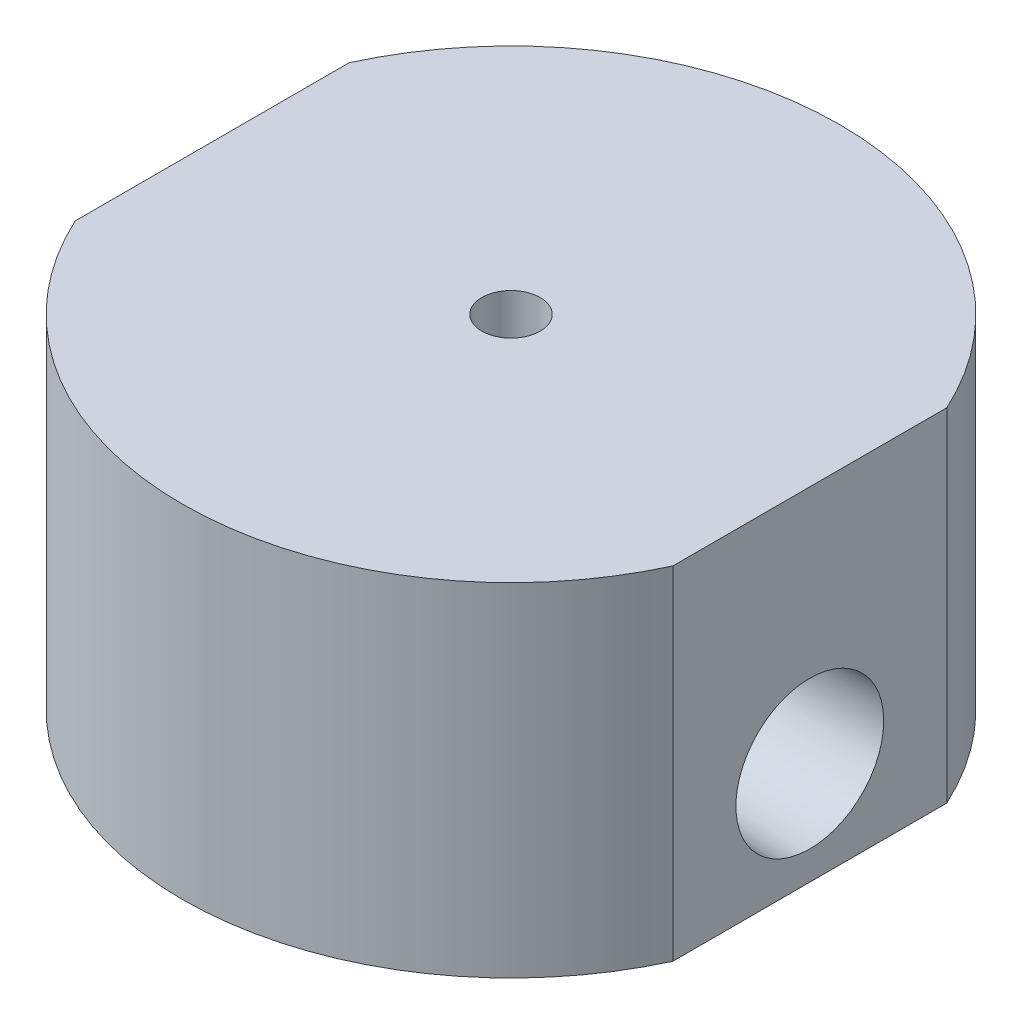
ISO-10303-21;
HEADER;
FILE_DESCRIPTION(('STEP AP214'),'2;1');
FILE_NAME('part.step','',(''),(''),'','','');
FILE_SCHEMA(('AUTOMOTIVE_DESIGN { 1 0 10303 214 1 1 1 1 }'));
ENDSEC;
DATA;
#1=APPLICATION_CONTEXT('core data for automotive mechanical design processes');
#2=APPLICATION_PROTOCOL_DEFINITION('international standard','automotive_design',2000,#1);
#3=PRODUCT_CONTEXT('',#1,'mechanical');
#4=PRODUCT('Part','Part','',(#3));
#5=PRODUCT_RELATED_PRODUCT_CATEGORY('part','',(#4));
#6=PRODUCT_DEFINITION_FORMATION('','',#4);
#7=PRODUCT_DEFINITION_CONTEXT('part definition',#1,'design');
#8=PRODUCT_DEFINITION('design','',#6,#7);
#9=PRODUCT_DEFINITION_SHAPE('','',#8);
#10=(LENGTH_UNIT() NAMED_UNIT(*) SI_UNIT(.MILLI.,.METRE.));
#11=(NAMED_UNIT(*) PLANE_ANGLE_UNIT() SI_UNIT($,.RADIAN.));
#12=(NAMED_UNIT(*) SI_UNIT($,.STERADIAN.) SOLID_ANGLE_UNIT());
#13=UNCERTAINTY_MEASURE_WITH_UNIT(LENGTH_MEASURE(1.E-05),#10,'distance_accuracy_value','');
#14=(GEOMETRIC_REPRESENTATION_CONTEXT(3) GLOBAL_UNCERTAINTY_ASSIGNED_CONTEXT((#13)) GLOBAL_UNIT_ASSIGNED_CONTEXT((#10,
#11,#12)) REPRESENTATION_CONTEXT('',''));
#15=CARTESIAN_POINT('',(0.,0.,0.));
#16=DIRECTION('',(0.,0.,1.));
#17=DIRECTION('',(1.,0.,0.));
#18=AXIS2_PLACEMENT_3D('',#15,#16,#17);
#19=CARTESIAN_POINT('',(-30.48,0.,0.));
#20=DIRECTION('',(0.,1.,0.));
#21=DIRECTION('',(-1.,0.,0.));
#22=AXIS2_PLACEMENT_3D('',#19,#20,#21);
#23=PLANE('',#22);
#24=CARTESIAN_POINT('',(0.,0.,0.));
#25=DIRECTION('',(0.,-1.,0.));
#26=DIRECTION('',(1.,0.,0.));
#27=AXIS2_PLACEMENT_3D('',#24,#25,#26);
#28=CIRCLE('',#27,17.145);
#29=CARTESIAN_POINT('',(17.145,0.,0.));
#30=VERTEX_POINT('',#29);
#31=EDGE_CURVE('E97',#30,#30,#28,.T.);
#32=ORIENTED_EDGE('',*,*,#31,.F.);
#33=EDGE_LOOP('',(#32));
#34=FACE_BOUND('',#33,.T.);
#35=DIRECTION('',(0.,0.,-1.));
#36=VECTOR('',#35,1.);
#37=CARTESIAN_POINT('',(-27.7081287711747,0.,-12.7));
#38=LINE('',#37,#36);
#39=CARTESIAN_POINT('',(-27.7081287711747,0.,12.7));
#40=VERTEX_POINT('',#39);
#41=CARTESIAN_POINT('',(-27.7081287711747,0.,-12.7));
#42=VERTEX_POINT('',#41);
#43=EDGE_CURVE('E78',#40,#42,#38,.T.);
#44=ORIENTED_EDGE('',*,*,#43,.T.);
#45=CARTESIAN_POINT('',(0.,0.,0.));
#46=DIRECTION('',(0.,-1.,0.));
#47=DIRECTION('',(1.,0.,0.));
#48=AXIS2_PLACEMENT_3D('',#45,#46,#47);
#49=CIRCLE('',#48,30.48);
#50=CARTESIAN_POINT('',(27.7081287711747,0.,-12.7));
#51=VERTEX_POINT('',#50);
#52=EDGE_CURVE('E90',#42,#51,#49,.T.);
#53=ORIENTED_EDGE('',*,*,#52,.T.);
#54=DIRECTION('',(0.,0.,1.));
#55=VECTOR('',#54,1.);
#56=CARTESIAN_POINT('',(27.7081287711747,0.,-12.7));
#57=LINE('',#56,#55);
#58=CARTESIAN_POINT('',(27.7081287711747,0.,12.7));
#59=VERTEX_POINT('',#58);
#60=EDGE_CURVE('E119',#51,#59,#57,.T.);
#61=ORIENTED_EDGE('',*,*,#60,.T.);
#62=EDGE_CURVE('E92',#59,#40,#49,.T.);
#63=ORIENTED_EDGE('',*,*,#62,.T.);
#64=EDGE_LOOP('',(#44,#53,#61,#63));
#65=FACE_BOUND('',#64,.T.);
#66=ADVANCED_FACE('F36',(#34,#65),#23,.F.);
#67=CARTESIAN_POINT('',(0.,0.,0.));
#68=DIRECTION('',(0.,-1.,0.));
#69=DIRECTION('',(1.,0.,0.));
#70=AXIS2_PLACEMENT_3D('',#67,#68,#69);
#71=CYLINDRICAL_SURFACE('',#70,30.48);
#72=DIRECTION('',(0.,-1.,0.));
#73=VECTOR('',#72,1.);
#74=CARTESIAN_POINT('',(-27.7081287711747,31.75,-12.7));
#75=LINE('',#74,#73);
#76=CARTESIAN_POINT('',(-27.7081287711747,31.75,-12.7));
#77=VERTEX_POINT('',#76);
#78=EDGE_CURVE('E75',#77,#42,#75,.T.);
#79=ORIENTED_EDGE('',*,*,#78,.F.);
#80=CARTESIAN_POINT('',(0.,31.75,0.));
#81=DIRECTION('',(0.,-1.,0.));
#82=DIRECTION('',(1.,0.,0.));
#83=AXIS2_PLACEMENT_3D('',#80,#81,#82);
#84=CIRCLE('',#83,30.48);
#85=CARTESIAN_POINT('',(27.7081287711747,31.75,-12.7));
#86=VERTEX_POINT('',#85);
#87=EDGE_CURVE('E99',#77,#86,#84,.T.);
#88=ORIENTED_EDGE('',*,*,#87,.T.);
#89=DIRECTION('',(0.,-1.,0.));
#90=VECTOR('',#89,1.);
#91=CARTESIAN_POINT('',(27.7081287711747,31.75,-12.7));
#92=LINE('',#91,#90);
#93=EDGE_CURVE('E51',#86,#51,#92,.T.);
#94=ORIENTED_EDGE('',*,*,#93,.T.);
#95=ORIENTED_EDGE('',*,*,#52,.F.);
#96=EDGE_LOOP('',(#79,#88,#94,#95));
#97=FACE_BOUND('',#96,.T.);
#98=ADVANCED_FACE('F94',(#97),#71,.T.);
#99=DIRECTION('',(0.,-1.,0.));
#100=VECTOR('',#99,1.);
#101=CARTESIAN_POINT('',(-27.7081287711747,31.75,12.7));
#102=LINE('',#101,#100);
#103=CARTESIAN_POINT('',(-27.7081287711747,31.75,12.7));
#104=VERTEX_POINT('',#103);
#105=EDGE_CURVE('E59',#104,#40,#102,.T.);
#106=ORIENTED_EDGE('',*,*,#105,.T.);
#107=ORIENTED_EDGE('',*,*,#62,.F.);
#108=DIRECTION('',(0.,-1.,0.));
#109=VECTOR('',#108,1.);
#110=CARTESIAN_POINT('',(27.7081287711747,31.75,12.7));
#111=LINE('',#110,#109);
#112=CARTESIAN_POINT('',(27.7081287711747,31.75,12.7));
#113=VERTEX_POINT('',#112);
#114=EDGE_CURVE('E201',#113,#59,#111,.T.);
#115=ORIENTED_EDGE('',*,*,#114,.F.);
#116=EDGE_CURVE('E95',#113,#104,#84,.T.);
#117=ORIENTED_EDGE('',*,*,#116,.T.);
#118=EDGE_LOOP('',(#106,#107,#115,#117));
#119=FACE_BOUND('',#118,.T.);
#120=ADVANCED_FACE('F153',(#119),#71,.T.);
#121=CARTESIAN_POINT('',(0.,31.75,0.));
#122=DIRECTION('',(0.,-1.,0.));
#123=DIRECTION('',(1.,0.,0.));
#124=AXIS2_PLACEMENT_3D('',#121,#122,#123);
#125=PLANE('',#124);
#126=CARTESIAN_POINT('',(0.,31.75,0.));
#127=DIRECTION('',(0.,1.,0.));
#128=DIRECTION('',(0.,0.,1.));
#129=AXIS2_PLACEMENT_3D('',#126,#127,#128);
#130=CIRCLE('',#129,2.7051);
#131=CARTESIAN_POINT('',(0.,31.75,2.7051));
#132=VERTEX_POINT('',#131);
#133=EDGE_CURVE('E84',#132,#132,#130,.T.);
#134=ORIENTED_EDGE('',*,*,#133,.F.);
#135=EDGE_LOOP('',(#134));
#136=FACE_BOUND('',#135,.T.);
#137=DIRECTION('',(0.,0.,-1.));
#138=VECTOR('',#137,1.);
#139=CARTESIAN_POINT('',(-27.7081287711747,31.75,-12.7));
#140=LINE('',#139,#138);
#141=EDGE_CURVE('E79',#104,#77,#140,.T.);
#142=ORIENTED_EDGE('',*,*,#141,.F.);
#143=ORIENTED_EDGE('',*,*,#116,.F.);
#144=DIRECTION('',(0.,0.,1.));
#145=VECTOR('',#144,1.);
#146=CARTESIAN_POINT('',(27.7081287711747,31.75,-12.7));
#147=LINE('',#146,#145);
#148=EDGE_CURVE('E199',#86,#113,#147,.T.);
#149=ORIENTED_EDGE('',*,*,#148,.F.);
#150=ORIENTED_EDGE('',*,*,#87,.F.);
#151=EDGE_LOOP('',(#142,#143,#149,#150));
#152=FACE_BOUND('',#151,.T.);
#153=ADVANCED_FACE('F149',(#136,#152),#125,.F.);
#154=CARTESIAN_POINT('',(-4.7625,9.8425,0.));
#155=DIRECTION('',(0.,1.,0.));
#156=DIRECTION('',(-1.,0.,0.));
#157=AXIS2_PLACEMENT_3D('',#154,#155,#156);
#158=PLANE('',#157);
#159=CARTESIAN_POINT('',(0.,9.8425,0.));
#160=DIRECTION('',(0.,1.,0.));
#161=DIRECTION('',(-1.,0.,0.));
#162=AXIS2_PLACEMENT_3D('',#159,#160,#161);
#163=CIRCLE('',#162,2.70509999999999);
#164=CARTESIAN_POINT('',(-2.70509999999999,9.8425,0.));
#165=VERTEX_POINT('',#164);
#166=EDGE_CURVE('E206',#165,#165,#163,.T.);
#167=ORIENTED_EDGE('',*,*,#166,.T.);
#168=EDGE_LOOP('',(#167));
#169=FACE_BOUND('',#168,.T.);
#170=CARTESIAN_POINT('',(0.,9.8425,0.));
#171=DIRECTION('',(0.,-1.,0.));
#172=DIRECTION('',(1.,0.,0.));
#173=AXIS2_PLACEMENT_3D('',#170,#171,#172);
#174=CIRCLE('',#173,4.7625);
#175=CARTESIAN_POINT('',(4.7625,9.8425,0.));
#176=VERTEX_POINT('',#175);
#177=EDGE_CURVE('E108',#176,#176,#174,.T.);
#178=ORIENTED_EDGE('',*,*,#177,.T.);
#179=EDGE_LOOP('',(#178));
#180=FACE_BOUND('',#179,.T.);
#181=ADVANCED_FACE('F152',(#169,#180),#158,.F.);
#182=CARTESIAN_POINT('',(0.,9.8425,0.));
#183=DIRECTION('',(0.,-1.,0.));
#184=DIRECTION('',(1.,0.,0.));
#185=AXIS2_PLACEMENT_3D('',#182,#183,#184);
#186=TOROIDAL_SURFACE('',#185,13.97,9.2075);
#187=ORIENTED_EDGE('',*,*,#177,.F.);
#188=EDGE_LOOP('',(#187));
#189=FACE_BOUND('',#188,.T.);
#190=CARTESIAN_POINT('',(0.,19.05,0.));
#191=DIRECTION('',(0.,-1.,0.));
#192=DIRECTION('',(1.,0.,0.));
#193=AXIS2_PLACEMENT_3D('',#190,#191,#192);
#194=CIRCLE('',#193,13.97);
#195=CARTESIAN_POINT('',(13.97,19.05,0.));
#196=VERTEX_POINT('',#195);
#197=EDGE_CURVE('E105',#196,#196,#194,.T.);
#198=ORIENTED_EDGE('',*,*,#197,.T.);
#199=EDGE_LOOP('',(#198));
#200=FACE_BOUND('',#199,.T.);
#201=ADVANCED_FACE('F168',(#189,#200),#186,.F.);
#202=CARTESIAN_POINT('',(-17.145,19.05,0.));
#203=DIRECTION('',(0.,1.,0.));
#204=DIRECTION('',(-1.,0.,0.));
#205=AXIS2_PLACEMENT_3D('',#202,#203,#204);
#206=PLANE('',#205);
#207=CARTESIAN_POINT('',(0.,19.05,0.));
#208=DIRECTION('',(0.,1.,0.));
#209=DIRECTION('',(-1.,0.,0.));
#210=AXIS2_PLACEMENT_3D('',#207,#208,#209);
#211=CIRCLE('',#210,15.5575);
#212=CARTESIAN_POINT('',(-15.5575,19.05,0.));
#213=VERTEX_POINT('',#212);
#214=EDGE_CURVE('E44',#213,#213,#211,.F.);
#215=ORIENTED_EDGE('',*,*,#214,.T.);
#216=EDGE_LOOP('',(#215));
#217=FACE_BOUND('',#216,.T.);
#218=ORIENTED_EDGE('',*,*,#197,.F.);
#219=EDGE_LOOP('',(#218));
#220=FACE_BOUND('',#219,.T.);
#221=ADVANCED_FACE('F163',(#217,#220),#206,.F.);
#222=CARTESIAN_POINT('',(0.,0.,0.));
#223=DIRECTION('',(0.,-1.,0.));
#224=DIRECTION('',(1.,0.,0.));
#225=AXIS2_PLACEMENT_3D('',#222,#223,#224);
#226=CYLINDRICAL_SURFACE('',#225,17.145);
#227=CARTESIAN_POINT('',(0.,17.4625,0.));
#228=DIRECTION('',(0.,1.,0.));
#229=DIRECTION('',(-1.,0.,0.));
#230=AXIS2_PLACEMENT_3D('',#227,#228,#229);
#231=CIRCLE('',#230,17.145);
#232=CARTESIAN_POINT('',(-17.145,17.4625,0.));
#233=VERTEX_POINT('',#232);
#234=EDGE_CURVE('E11',#233,#233,#231,.T.);
#235=ORIENTED_EDGE('',*,*,#234,.T.);
#236=EDGE_LOOP('',(#235));
#237=FACE_BOUND('',#236,.T.);
#238=CARTESIAN_POINT('',(-16.2175369967206,9.525,5.5626));
#239=CARTESIAN_POINT('',(-16.2175373161159,9.82849181906026,5.56260003117367));
#240=CARTESIAN_POINT('',(-16.2261493700106,10.1319876366325,5.53767846198275));
#241=CARTESIAN_POINT('',(-16.2594997447976,10.7300205021712,5.4389649940734));
#242=CARTESIAN_POINT('',(-16.2842414432936,11.0245556602204,5.36516285954266));
#243=CARTESIAN_POINT('',(-16.3467601648377,11.5959122053179,5.17152705940594));
#244=CARTESIAN_POINT('',(-16.3845127129545,11.872765702792,5.05177977442356));
#245=CARTESIAN_POINT('',(-16.4687644613011,12.4025377488866,4.76994506890399));
#246=CARTESIAN_POINT('',(-16.5152654284901,12.6554514467351,4.60784909242799));
#247=CARTESIAN_POINT('',(-16.6137067208312,13.1395346508984,4.23948599975569));
#248=CARTESIAN_POINT('',(-16.6657773501814,13.3696873614373,4.03191716501639));
#249=CARTESIAN_POINT('',(-16.7683863507867,13.7926043892472,3.58128174195327));
#250=CARTESIAN_POINT('',(-16.8189244893149,13.9853630515395,3.33820979433835));
#251=CARTESIAN_POINT('',(-16.9142750302417,14.3325787240406,2.81608838355148));
#252=CARTESIAN_POINT('',(-16.9589162378499,14.4859782718915,2.53630167897334));
#253=CARTESIAN_POINT('',(-17.0359136898919,14.7431394103604,1.95320144343989));
#254=CARTESIAN_POINT('',(-17.0682730600142,14.8469136322153,1.64989392215376));
#255=CARTESIAN_POINT('',(-17.1161381297064,14.9984533411496,1.03901648687674));
#256=CARTESIAN_POINT('',(-17.1321662131814,15.0479589566738,0.731919932837765));
#257=CARTESIAN_POINT('',(-17.1474130318144,15.0950806734102,0.113388786408482));
#258=CARTESIAN_POINT('',(-17.1466358770458,15.0927094621864,-0.198044726667037));
#259=CARTESIAN_POINT('',(-17.1287180108608,15.0372663733416,-0.804122746427338));
#260=CARTESIAN_POINT('',(-17.1121868068286,14.9860829360263,-1.09896094352305));
#261=CARTESIAN_POINT('',(-17.0653767698699,14.8375806500651,-1.67561073097976));
#262=CARTESIAN_POINT('',(-17.0350970189771,14.7402587208142,-1.95742145013446));
#263=CARTESIAN_POINT('',(-16.9633978272153,14.5010919105738,-2.50424441617604));
#264=CARTESIAN_POINT('',(-16.9218410523089,14.3586942690539,-2.76899614920628));
#265=CARTESIAN_POINT('',(-16.8319365247394,14.0338683199135,-3.2714176892161));
#266=CARTESIAN_POINT('',(-16.783586956844,13.8514293047201,-3.50908022632253));
#267=CARTESIAN_POINT('',(-16.6826618225277,13.4421046243956,-3.96182335487714));
#268=CARTESIAN_POINT('',(-16.6299939652978,13.2135954302867,-4.1754176465158));
#269=CARTESIAN_POINT('',(-16.528210971282,12.7235323911488,-4.56171834957772));
#270=CARTESIAN_POINT('',(-16.4790963243754,12.4619740032463,-4.73441913046663));
#271=CARTESIAN_POINT('',(-16.3894923531999,11.9087501040146,-5.03594345842481));
#272=CARTESIAN_POINT('',(-16.3491222393084,11.6167402787305,-5.16417337114374));
#273=CARTESIAN_POINT('',(-16.2829653559251,11.0136390368442,-5.3691527448613));
#274=CARTESIAN_POINT('',(-16.2571728579188,10.7025551690465,-5.44592243021363));
#275=CARTESIAN_POINT('',(-16.2243770580853,10.0844664499069,-5.54284540517277));
#276=CARTESIAN_POINT('',(-16.2166136305252,9.77786123160744,-5.56529089235822));
#277=CARTESIAN_POINT('',(-16.2186365551243,9.16522916659387,-5.55939541285767));
#278=CARTESIAN_POINT('',(-16.2284199311028,8.85920223060823,-5.53106305879723));
#279=CARTESIAN_POINT('',(-16.2636789151857,8.26659820640551,-5.42647417726623));
#280=CARTESIAN_POINT('',(-16.2886432221545,7.97971208827752,-5.35177758862674));
#281=CARTESIAN_POINT('',(-16.3508996941385,7.42258497023048,-5.15842404109426));
#282=CARTESIAN_POINT('',(-16.3881939704813,7.15234683044347,-5.039759552919));
#283=CARTESIAN_POINT('',(-16.4723075633432,6.62711208706921,-4.7577684743554));
#284=CARTESIAN_POINT('',(-16.5193821742115,6.37282943825215,-4.59319279415123));
#285=CARTESIAN_POINT('',(-16.6172708356776,5.89456429423076,-4.22532903301452));
#286=CARTESIAN_POINT('',(-16.668085929855,5.67059030486688,-4.02203012315074));
#287=CARTESIAN_POINT('',(-16.7442833824317,5.35685121497472,-3.68700076961616));
#288=CARTESIAN_POINT('',(-16.7702387677678,5.25401691753267,-3.5673698733576));
#289=CARTESIAN_POINT('',(-16.8210209349275,5.05878081520846,-3.31967387595498));
#290=CARTESIAN_POINT('',(-16.8458481166682,4.96637529610489,-3.19161180347672));
#291=CARTESIAN_POINT('',(-16.8936950185274,4.79262120536255,-2.9278104765997));
#292=CARTESIAN_POINT('',(-16.9167140413749,4.71127689044406,-2.79206829493541));
#293=CARTESIAN_POINT('',(-16.9602824846454,4.56033527395427,-2.51389122102584));
#294=CARTESIAN_POINT('',(-16.9808329377216,4.49073305546131,-2.37145916222155));
#295=CARTESIAN_POINT('',(-17.018766005,4.36423367164702,-2.08178377869288));
#296=CARTESIAN_POINT('',(-17.0361685839203,4.30725587950976,-1.93457830219917));
#297=CARTESIAN_POINT('',(-17.0674689037446,4.20594835856417,-1.63557717299342));
#298=CARTESIAN_POINT('',(-17.0813680580471,4.16161352821191,-1.48378339912228));
#299=CARTESIAN_POINT('',(-17.1052664300598,4.08598152468582,-1.17669069410792));
#300=CARTESIAN_POINT('',(-17.1152659577368,4.05468331526669,-1.02139204259267));
#301=CARTESIAN_POINT('',(-17.1310715079375,4.00543020430713,-0.708483729700484));
#302=CARTESIAN_POINT('',(-17.1368776995737,3.98747476466683,-0.550874161781804));
#303=CARTESIAN_POINT('',(-17.1439619865434,3.96559119577777,-0.241704153823263));
#304=CARTESIAN_POINT('',(-17.1454316702517,3.9610694938191,-0.0901898143890592));
#305=CARTESIAN_POINT('',(-17.1443493297664,3.96440552442542,0.21274173029559));
#306=CARTESIAN_POINT('',(-17.1417959336921,3.97226747984959,0.364158884789719));
#307=CARTESIAN_POINT('',(-17.1327364966639,4.00029832455011,0.665659878894266));
#308=CARTESIAN_POINT('',(-17.1262322214545,4.02046171603145,0.815744283757885));
#309=CARTESIAN_POINT('',(-17.1094458189799,4.07291353326605,1.1136206676183));
#310=CARTESIAN_POINT('',(-17.0991622808844,4.10520648718557,1.26141176900443));
#311=CARTESIAN_POINT('',(-17.0752719362683,4.18106137886422,1.55144274830167));
#312=CARTESIAN_POINT('',(-17.0617165482866,4.22444952401836,1.69373240620499));
#313=CARTESIAN_POINT('',(-17.0315494144631,4.32237195488643,1.97414381819016));
#314=CARTESIAN_POINT('',(-17.0149365742114,4.37691023254908,2.11226405916351));
#315=CARTESIAN_POINT('',(-16.9790806920536,4.49668642791027,2.38338829761733));
#316=CARTESIAN_POINT('',(-16.9598382580099,4.56192187352383,2.51639346842933));
#317=CARTESIAN_POINT('',(-16.9191906305605,4.70265154034903,2.77657371209609));
#318=CARTESIAN_POINT('',(-16.8977846183596,4.77814964916909,2.90374655106657));
#319=CARTESIAN_POINT('',(-16.8525517987156,4.9417276047256,3.15586656244736));
#320=CARTESIAN_POINT('',(-16.8286661888601,5.03015768609195,3.28057642683856));
#321=CARTESIAN_POINT('',(-16.779763633825,5.2168581499481,3.5221836654862));
#322=CARTESIAN_POINT('',(-16.7547462704522,5.31513218642726,3.63907811168129));
#323=CARTESIAN_POINT('',(-16.678972264328,5.62380045881892,3.97694154370277));
#324=CARTESIAN_POINT('',(-16.6274593166859,5.84816033797046,4.18527426008522));
#325=CARTESIAN_POINT('',(-16.5260907201985,6.33715299199246,4.56951206590627));
#326=CARTESIAN_POINT('',(-16.4763642375108,6.60295702971999,4.74395558574622));
#327=CARTESIAN_POINT('',(-16.3865206625985,7.16166890345833,5.04557433658746));
#328=CARTESIAN_POINT('',(-16.3464004480737,7.45456788984054,5.17276493351728));
#329=CARTESIAN_POINT('',(-16.2829169343496,8.04033889972043,5.36914111360421));
#330=CARTESIAN_POINT('',(-16.2586615929894,8.33206393325116,5.44146038806573));
#331=CARTESIAN_POINT('',(-16.2259738329918,8.9241930879014,5.53818264817003));
#332=CARTESIAN_POINT('',(-16.2175366805734,9.22459458515138,5.56259996914335));
#333=CARTESIAN_POINT('',(-16.2175369967206,9.525,5.5626));
#334=B_SPLINE_CURVE_WITH_KNOTS('',3,(#238,#239,#240,#241,#242,#243,#244,#245,#246,#247,#248,
#249,#250,#251,#252,#253,#254,#255,#256,#257,#258,#259,#260,#261,#262,#263,#264,#265,#266,#267,
#268,#269,#270,#271,#272,#273,#274,#275,#276,#277,#278,#279,#280,#281,#282,#283,#284,#285,#286,
#287,#288,#289,#290,#291,#292,#293,#294,#295,#296,#297,#298,#299,#300,#301,#302,#303,#304,#305,
#306,#307,#308,#309,#310,#311,#312,#313,#314,#315,#316,#317,#318,#319,#320,#321,#322,#323,#324,
#325,#326,#327,#328,#329,#330,#331,#332,#333),.UNSPECIFIED.,.T.,.F.,(4,2,2,2,2,2,2,2,2,2,2,2,2,
2,2,2,2,2,2,2,2,2,2,2,2,2,2,2,2,2,2,2,2,2,2,2,2,2,2,2,2,2,2,2,2,2,2,4),(0.,0.909363788151947,
1.81891806144195,2.72677061222585,3.63480672348078,4.57336835121982,5.51207180408495,
6.47383969735966,7.43536265938961,8.36506047544932,9.29453091698624,10.1894416072369,
11.0844120578868,11.9908128354861,12.897456292151,13.844668397576,14.7920108467403,
15.7515520376588,16.7107158984123,17.6286426226613,18.5464136685514,19.4348648866317,
20.323468317896,21.2391096629197,22.1550074435146,22.634161910668,23.1131451842578,
23.5923122680523,24.0712782032104,24.5470908730172,25.0227112757658,25.4982938655333,
25.9738572745147,26.4280700001653,26.8824376470645,27.3366023752072,27.790936819338,
28.2385494106777,28.686322536921,29.1339923295321,29.5818321793832,30.0454916925049,
30.5093239542499,31.4363309886919,32.397181757396,33.3577197980515,34.258105172912,
35.158221053709),.UNSPECIFIED.);
#335=CARTESIAN_POINT('',(-16.2175369967206,9.525,5.5626));
#336=VERTEX_POINT('',#335);
#337=EDGE_CURVE('E121',#336,#336,#334,.T.);
#338=ORIENTED_EDGE('',*,*,#337,.T.);
#339=EDGE_LOOP('',(#338));
#340=FACE_BOUND('',#339,.T.);
#341=CARTESIAN_POINT('',(17.145,15.0876,0.));
#342=CARTESIAN_POINT('',(17.1449997627393,15.0875999457994,0.303967402442568));
#343=CARTESIAN_POINT('',(17.1368410627552,15.0626033137947,0.607939008563892));
#344=CARTESIAN_POINT('',(17.1050959927723,14.9635630631436,1.20695677786402));
#345=CARTESIAN_POINT('',(17.0815072095492,14.889511772455,1.50200153735453));
#346=CARTESIAN_POINT('',(17.021471577116,14.6951518358235,2.07444052426007));
#347=CARTESIAN_POINT('',(16.9850455452424,14.5749180528296,2.35186247487693));
#348=CARTESIAN_POINT('',(16.9030701724205,14.2919226763726,2.88261105620476));
#349=CARTESIAN_POINT('',(16.8575191844825,14.1291534039391,3.13593332490308));
#350=CARTESIAN_POINT('',(16.7604303930696,13.760107615418,3.61962902636983));
#351=CARTESIAN_POINT('',(16.7087547679927,13.5526805172178,3.84909518503403));
#352=CARTESIAN_POINT('',(16.6059908160138,13.1024656538985,4.27074635956158));
#353=CARTESIAN_POINT('',(16.5549026115344,12.8596706569768,4.46292373206516));
#354=CARTESIAN_POINT('',(16.4822932778733,12.4702374935959,4.72158502703653));
#355=CARTESIAN_POINT('',(16.4584679900803,12.3342046421183,4.80376866552929));
#356=CARTESIAN_POINT('',(16.4131694492969,12.0553199630633,4.95633133704332));
#357=CARTESIAN_POINT('',(16.3916952698492,11.9124708535331,5.02671502570028));
#358=CARTESIAN_POINT('',(16.3517696141078,11.6208836549928,5.15511228552652));
#359=CARTESIAN_POINT('',(16.3333187114097,11.4721444551077,5.21312350993968));
#360=CARTESIAN_POINT('',(16.3000533830934,11.1699230979566,5.31622242155331));
#361=CARTESIAN_POINT('',(16.2852373194645,11.0164431123252,5.36131593155816));
#362=CARTESIAN_POINT('',(16.2601390487831,10.7107797245399,5.4369514583302));
#363=CARTESIAN_POINT('',(16.2497277778044,10.5587099897139,5.46791018894741));
#364=CARTESIAN_POINT('',(16.2331193018845,10.2523491927867,5.51702247364523));
#365=CARTESIAN_POINT('',(16.2269203562157,10.0980590752008,5.53518131734738));
#366=CARTESIAN_POINT('',(16.218937312962,9.78839470633145,5.55852951858953));
#367=CARTESIAN_POINT('',(16.2171529763972,9.63302051418983,5.5637195781806));
#368=CARTESIAN_POINT('',(16.2180589174016,9.3223981304327,5.56107837087441));
#369=CARTESIAN_POINT('',(16.2207490772706,9.16714993561033,5.5532474464898));
#370=CARTESIAN_POINT('',(16.2303009252215,8.86468245411837,5.52526574584431));
#371=CARTESIAN_POINT('',(16.2369772048613,8.71740626681476,5.50566232668235));
#372=CARTESIAN_POINT('',(16.2541402404576,8.42505922915621,5.45478415867462));
#373=CARTESIAN_POINT('',(16.2646282821853,8.27998914017845,5.42350547146915));
#374=CARTESIAN_POINT('',(16.2890980029405,7.99312949995542,5.34956303081036));
#375=CARTESIAN_POINT('',(16.3030786870037,7.85133902697866,5.30690251951246));
#376=CARTESIAN_POINT('',(16.3341348768719,7.57186014329911,5.21053018946159));
#377=CARTESIAN_POINT('',(16.3512115595316,7.43417331573273,5.15681416722146));
#378=CARTESIAN_POINT('',(16.3882566731259,7.16175448710806,5.03785701897013));
#379=CARTESIAN_POINT('',(16.4082648127188,7.02709830917939,4.97245437460245));
#380=CARTESIAN_POINT('',(16.4504165024618,6.76372753210059,4.83117567912394));
#381=CARTESIAN_POINT('',(16.4725608278168,6.63501511513981,4.75529582157379));
#382=CARTESIAN_POINT('',(16.5413051281061,6.25898281845628,4.51270287806573));
#383=CARTESIAN_POINT('',(16.590245221353,6.02156629853206,4.33094798313228));
#384=CARTESIAN_POINT('',(16.6917284314372,5.56814708121361,3.92219832274201));
#385=CARTESIAN_POINT('',(16.7443302406473,5.3537766939808,3.69341524708786));
#386=CARTESIAN_POINT('',(16.845115512159,4.9659975916183,3.20247004823953));
#387=CARTESIAN_POINT('',(16.8932985939385,4.79259240221501,2.94030505497069));
#388=CARTESIAN_POINT('',(16.9803866989377,4.49049746686942,2.38675314472736));
#389=CARTESIAN_POINT('',(17.0192046645436,4.36222256602025,2.0951253061137));
#390=CARTESIAN_POINT('',(17.0825603974636,4.15704358927124,1.49287131998469));
#391=CARTESIAN_POINT('',(17.1071028530547,4.08012264678621,1.18225144679666));
#392=CARTESIAN_POINT('',(17.1383748071815,3.98267026538071,0.564610762401489));
#393=CARTESIAN_POINT('',(17.1457983422192,3.95994043578224,0.257971443097835));
#394=CARTESIAN_POINT('',(17.1440649774214,3.96528084662131,-0.354788464828586));
#395=CARTESIAN_POINT('',(17.1349107110218,3.99334301858925,-0.660909128109648));
#396=CARTESIAN_POINT('',(17.1015082328178,4.09771715443461,-1.25527951504563));
#397=CARTESIAN_POINT('',(17.0776767925422,4.17269773898281,-1.54378880408626));
#398=CARTESIAN_POINT('',(17.0177401240059,4.36714385444941,-2.10403867439739));
#399=CARTESIAN_POINT('',(16.9816333488602,4.48661499205742,-2.37577713717864));
#400=CARTESIAN_POINT('',(16.8996945112524,4.77000136245751,-2.90245854132264));
#401=CARTESIAN_POINT('',(16.8536378651869,4.93497256050591,-3.15679623760537));
#402=CARTESIAN_POINT('',(16.7570099378121,5.30357916444504,-3.63499691990927));
#403=CARTESIAN_POINT('',(16.7064373455543,5.50722581701651,-3.85885100881549));
#404=CARTESIAN_POINT('',(16.6300115364386,5.84243073370051,-4.17205300652204));
#405=CARTESIAN_POINT('',(16.6038972662295,5.96191838765376,-4.27454853223359));
#406=CARTESIAN_POINT('',(16.5525841874853,6.20925631734685,-4.46912561681093));
#407=CARTESIAN_POINT('',(16.5273850571849,6.33710360866232,-4.56121086049553));
#408=CARTESIAN_POINT('',(16.4786205247605,6.60041902860155,-4.73436311545948));
#409=CARTESIAN_POINT('',(16.4550558095062,6.73589031843814,-4.81542550792107));
#410=CARTESIAN_POINT('',(16.4102855108884,7.01348376080037,-4.96585456661157));
#411=CARTESIAN_POINT('',(16.3890789466787,7.15560311293107,-5.03522610175605));
#412=CARTESIAN_POINT('',(16.3497221096626,7.44523182006082,-5.16158739065871));
#413=CARTESIAN_POINT('',(16.3315644248728,7.5927270105419,-5.21860727287293));
#414=CARTESIAN_POINT('',(16.2988320904541,7.89233935884057,-5.31995635103333));
#415=CARTESIAN_POINT('',(16.2842559804393,8.04445460430921,-5.36429072070982));
#416=CARTESIAN_POINT('',(16.2591643536896,8.3522112506355,-5.43987018865227));
#417=CARTESIAN_POINT('',(16.2486482434546,8.5078521325832,-5.4711172001152));
#418=CARTESIAN_POINT('',(16.2320348895216,8.82146433390041,-5.5202122562237));
#419=CARTESIAN_POINT('',(16.2259374387585,8.97943554371325,-5.5380609287369));
#420=CARTESIAN_POINT('',(16.2185585572931,9.28867249870174,-5.55963163281555));
#421=CARTESIAN_POINT('',(16.2170560515489,9.43988808367504,-5.56400222302559));
#422=CARTESIAN_POINT('',(16.2182869341483,9.74220898510439,-5.56041351023087));
#423=CARTESIAN_POINT('',(16.221021764664,9.89331424649832,-5.55245000933346));
#424=CARTESIAN_POINT('',(16.2306409374955,10.1941765619149,-5.52426827121022));
#425=CARTESIAN_POINT('',(16.2375234931319,10.34393416828,-5.50405531055624));
#426=CARTESIAN_POINT('',(16.2552222314857,10.641136829428,-5.45156312381778));
#427=CARTESIAN_POINT('',(16.2660398909152,10.7885809943582,-5.41927936784313));
#428=CARTESIAN_POINT('',(16.2910561114472,11.0775301186512,-5.34360130740253));
#429=CARTESIAN_POINT('',(16.3051923397676,11.219093828891,-5.30041084938294));
#430=CARTESIAN_POINT('',(16.3365290867754,11.4980512125878,-5.20302298470513));
#431=CARTESIAN_POINT('',(16.353730698752,11.6354433777064,-5.14882164997677));
#432=CARTESIAN_POINT('',(16.40922443435,12.0400074968107,-4.97030999586086));
#433=CARTESIAN_POINT('',(16.4514267789062,12.299799438459,-4.83003070861246));
#434=CARTESIAN_POINT('',(16.5436586328947,12.8034441731764,-4.50423290709195));
#435=CARTESIAN_POINT('',(16.5939411931938,13.0461801758232,-4.31707150992602));
#436=CARTESIAN_POINT('',(16.6955752410162,13.4976759401028,-3.90559202101452));
#437=CARTESIAN_POINT('',(16.7469270200987,13.7064262938207,-3.68126367526287));
#438=CARTESIAN_POINT('',(16.8471394784855,14.0915636982463,-3.19208103027033));
#439=CARTESIAN_POINT('',(16.8958428159652,14.2665066322052,-2.92605416669595));
#440=CARTESIAN_POINT('',(16.9832042386294,14.5689828436599,-2.36679674838043));
#441=CARTESIAN_POINT('',(17.02186550117,14.6965311225439,-2.07357483821691));
#442=CARTESIAN_POINT('',(17.0827784138157,14.8935232611988,-1.48700362132826));
#443=CARTESIAN_POINT('',(17.1058988580837,14.966079343369,-1.19478939617522));
#444=CARTESIAN_POINT('',(17.137007936293,15.0631119176412,-0.601716745831059));
#445=CARTESIAN_POINT('',(17.1450002348356,15.0876000536466,-0.300860432007047));
#446=CARTESIAN_POINT('',(17.145,15.0876,0.));
#447=B_SPLINE_CURVE_WITH_KNOTS('',3,(#341,#342,#343,#344,#345,#346,#347,#348,#349,#350,#351,
#352,#353,#354,#355,#356,#357,#358,#359,#360,#361,#362,#363,#364,#365,#366,#367,#368,#369,#370,
#371,#372,#373,#374,#375,#376,#377,#378,#379,#380,#381,#382,#383,#384,#385,#386,#387,#388,#389,
#390,#391,#392,#393,#394,#395,#396,#397,#398,#399,#400,#401,#402,#403,#404,#405,#406,#407,#408,
#409,#410,#411,#412,#413,#414,#415,#416,#417,#418,#419,#420,#421,#422,#423,#424,#425,#426,#427,
#428,#429,#430,#431,#432,#433,#434,#435,#436,#437,#438,#439,#440,#441,#442,#443,#444,#445,#446),
.UNSPECIFIED.,.T.,.F.,(4,2,2,2,2,2,2,2,2,2,2,2,2,2,2,2,2,2,2,2,2,2,2,2,2,2,2,2,2,2,2,2,2,2,2,2,
2,2,2,2,2,2,2,2,2,2,2,2,2,2,2,2,4),(0.,0.910795693648027,1.82173386740501,2.73120157782009,
3.64083358882494,4.57753529054291,5.51442879261011,5.99605686390749,6.47749446076282,
6.95902329359092,7.44033472913129,7.90635789563234,8.37218836248597,8.83799361156585,
9.30378660798793,9.74943852733549,10.1952409122684,10.6409164440457,11.0867617430792,
11.5393274706955,11.9920580531227,12.8968608625043,13.8462617746375,14.7957443685287,
15.7537397559374,16.7114203463797,17.6295351873717,18.5475041957265,19.4405372101975,
20.3336828025952,21.2496112217163,22.1658063984387,22.6440688146165,23.1221614116746,
23.6004537267834,24.078546351579,24.5554593311527,25.0321775257204,25.5088260061105,
25.9854521485947,26.4387541090837,26.8922103842398,27.345471467476,27.7989028201138,
28.2444167235337,28.6900898415929,29.5807208169018,30.508500063076,31.4365357022199,
32.3981468852286,33.3594534386252,34.2611579855335,35.1626440779867),.UNSPECIFIED.);
#448=CARTESIAN_POINT('',(17.145,15.0876,0.));
#449=VERTEX_POINT('',#448);
#450=EDGE_CURVE('E111',#449,#449,#447,.T.);
#451=ORIENTED_EDGE('',*,*,#450,.T.);
#452=EDGE_LOOP('',(#451));
#453=FACE_BOUND('',#452,.T.);
#454=ORIENTED_EDGE('',*,*,#31,.T.);
#455=EDGE_LOOP('',(#454));
#456=FACE_BOUND('',#455,.T.);
#457=ADVANCED_FACE('F126',(#237,#340,#453,#456),#226,.F.);
#458=CARTESIAN_POINT('',(0.,31.75,0.));
#459=DIRECTION('',(0.,1.,0.));
#460=DIRECTION('',(0.,0.,1.));
#461=AXIS2_PLACEMENT_3D('',#458,#459,#460);
#462=CYLINDRICAL_SURFACE('',#461,2.70509999999999);
#463=ORIENTED_EDGE('',*,*,#133,.T.);
#464=EDGE_LOOP('',(#463));
#465=FACE_BOUND('',#464,.T.);
#466=ORIENTED_EDGE('',*,*,#166,.F.);
#467=EDGE_LOOP('',(#466));
#468=FACE_BOUND('',#467,.T.);
#469=ADVANCED_FACE('F144',(#465,#468),#462,.F.);
#470=CARTESIAN_POINT('',(27.7081287711747,31.75,-12.7));
#471=DIRECTION('',(1.,0.,0.));
#472=DIRECTION('',(0.,0.,-1.));
#473=AXIS2_PLACEMENT_3D('',#470,#471,#472);
#474=PLANE('',#473);
#475=CARTESIAN_POINT('',(27.7081287711747,9.525,0.));
#476=DIRECTION('',(1.,0.,0.));
#477=DIRECTION('',(0.,0.,-1.));
#478=AXIS2_PLACEMENT_3D('',#475,#476,#477);
#479=CIRCLE('',#478,6.8545837);
#480=CARTESIAN_POINT('',(27.7081287711747,9.525,-6.8545837));
#481=VERTEX_POINT('',#480);
#482=EDGE_CURVE('E178',#481,#481,#479,.T.);
#483=ORIENTED_EDGE('',*,*,#482,.F.);
#484=EDGE_LOOP('',(#483));
#485=FACE_BOUND('',#484,.T.);
#486=ORIENTED_EDGE('',*,*,#60,.F.);
#487=ORIENTED_EDGE('',*,*,#93,.F.);
#488=ORIENTED_EDGE('',*,*,#148,.T.);
#489=ORIENTED_EDGE('',*,*,#114,.T.);
#490=EDGE_LOOP('',(#486,#487,#488,#489));
#491=FACE_BOUND('',#490,.T.);
#492=ADVANCED_FACE('F140',(#485,#491),#474,.T.);
#493=CARTESIAN_POINT('',(-27.7081287711747,31.75,-12.7));
#494=DIRECTION('',(-1.,0.,0.));
#495=DIRECTION('',(0.,0.,1.));
#496=AXIS2_PLACEMENT_3D('',#493,#494,#495);
#497=PLANE('',#496);
#498=CARTESIAN_POINT('',(-27.7081287711747,9.525,0.));
#499=DIRECTION('',(-1.,0.,0.));
#500=DIRECTION('',(0.,0.,1.));
#501=AXIS2_PLACEMENT_3D('',#498,#499,#500);
#502=CIRCLE('',#501,6.8545837);
#503=CARTESIAN_POINT('',(-27.7081287711747,9.525,6.8545837));
#504=VERTEX_POINT('',#503);
#505=EDGE_CURVE('E189',#504,#504,#502,.T.);
#506=ORIENTED_EDGE('',*,*,#505,.F.);
#507=EDGE_LOOP('',(#506));
#508=FACE_BOUND('',#507,.T.);
#509=ORIENTED_EDGE('',*,*,#43,.F.);
#510=ORIENTED_EDGE('',*,*,#105,.F.);
#511=ORIENTED_EDGE('',*,*,#141,.T.);
#512=ORIENTED_EDGE('',*,*,#78,.T.);
#513=EDGE_LOOP('',(#509,#510,#511,#512));
#514=FACE_BOUND('',#513,.T.);
#515=ADVANCED_FACE('F77',(#508,#514),#497,.T.);
#516=CARTESIAN_POINT('',(27.7081287711747,9.525,0.));
#517=DIRECTION('',(1.,0.,0.));
#518=DIRECTION('',(0.,0.,-1.));
#519=AXIS2_PLACEMENT_3D('',#516,#517,#518);
#520=CYLINDRICAL_SURFACE('',#519,5.5626);
#521=CARTESIAN_POINT('',(17.8021287711747,9.525,0.));
#522=DIRECTION('',(1.,0.,0.));
#523=DIRECTION('',(0.,0.,-1.));
#524=AXIS2_PLACEMENT_3D('',#521,#522,#523);
#525=CIRCLE('',#524,5.56260000000001);
#526=CARTESIAN_POINT('',(17.8021287711747,9.525,-5.56260000000001));
#527=VERTEX_POINT('',#526);
#528=EDGE_CURVE('E120',#527,#527,#525,.T.);
#529=ORIENTED_EDGE('',*,*,#528,.T.);
#530=EDGE_LOOP('',(#529));
#531=FACE_BOUND('',#530,.T.);
#532=ORIENTED_EDGE('',*,*,#450,.F.);
#533=EDGE_LOOP('',(#532));
#534=FACE_BOUND('',#533,.T.);
#535=ADVANCED_FACE('F130',(#531,#534),#520,.F.);
#536=CARTESIAN_POINT('',(17.8021287711747,15.0876,0.));
#537=DIRECTION('',(-1.,0.,0.));
#538=DIRECTION('',(0.,0.,1.));
#539=AXIS2_PLACEMENT_3D('',#536,#537,#538);
#540=PLANE('',#539);
#541=ORIENTED_EDGE('',*,*,#528,.F.);
#542=EDGE_LOOP('',(#541));
#543=FACE_BOUND('',#542,.T.);
#544=CARTESIAN_POINT('',(17.8021287711747,9.525,0.));
#545=DIRECTION('',(1.,0.,0.));
#546=DIRECTION('',(0.,0.,-1.));
#547=AXIS2_PLACEMENT_3D('',#544,#545,#546);
#548=CIRCLE('',#547,6.55798479417672);
#549=CARTESIAN_POINT('',(17.8021287711747,9.525,-6.55798479417672));
#550=VERTEX_POINT('',#549);
#551=EDGE_CURVE('E181',#550,#550,#548,.T.);
#552=ORIENTED_EDGE('',*,*,#551,.T.);
#553=EDGE_LOOP('',(#552));
#554=FACE_BOUND('',#553,.T.);
#555=ADVANCED_FACE('F135',(#543,#554),#540,.F.);
#556=CARTESIAN_POINT('',(27.7081287711747,9.525,0.));
#557=DIRECTION('',(1.,0.,0.));
#558=DIRECTION('',(0.,0.,-1.));
#559=AXIS2_PLACEMENT_3D('',#556,#557,#558);
#560=CONICAL_SURFACE('',#559,6.8545837,0.0299323966717025);
#561=ORIENTED_EDGE('',*,*,#551,.F.);
#562=EDGE_LOOP('',(#561));
#563=FACE_BOUND('',#562,.T.);
#564=ORIENTED_EDGE('',*,*,#482,.T.);
#565=EDGE_LOOP('',(#564));
#566=FACE_BOUND('',#565,.T.);
#567=ADVANCED_FACE('F279',(#563,#566),#560,.F.);
#568=CARTESIAN_POINT('',(-27.7081287711747,9.525,0.));
#569=DIRECTION('',(-1.,0.,0.));
#570=DIRECTION('',(0.,0.,1.));
#571=AXIS2_PLACEMENT_3D('',#568,#569,#570);
#572=CYLINDRICAL_SURFACE('',#571,5.5626);
#573=CARTESIAN_POINT('',(-17.8021287711747,9.525,0.));
#574=DIRECTION('',(-1.,0.,0.));
#575=DIRECTION('',(0.,0.,1.));
#576=AXIS2_PLACEMENT_3D('',#573,#574,#575);
#577=CIRCLE('',#576,5.56260000000001);
#578=CARTESIAN_POINT('',(-17.8021287711747,9.525,5.56260000000001));
#579=VERTEX_POINT('',#578);
#580=EDGE_CURVE('E179',#579,#579,#577,.T.);
#581=ORIENTED_EDGE('',*,*,#580,.T.);
#582=EDGE_LOOP('',(#581));
#583=FACE_BOUND('',#582,.T.);
#584=ORIENTED_EDGE('',*,*,#337,.F.);
#585=EDGE_LOOP('',(#584));
#586=FACE_BOUND('',#585,.T.);
#587=ADVANCED_FACE('F271',(#583,#586),#572,.F.);
#588=CARTESIAN_POINT('',(-17.8021287711747,15.0876,0.));
#589=DIRECTION('',(1.,0.,0.));
#590=DIRECTION('',(0.,0.,-1.));
#591=AXIS2_PLACEMENT_3D('',#588,#589,#590);
#592=PLANE('',#591);
#593=ORIENTED_EDGE('',*,*,#580,.F.);
#594=EDGE_LOOP('',(#593));
#595=FACE_BOUND('',#594,.T.);
#596=CARTESIAN_POINT('',(-17.8021287711747,9.525,0.));
#597=DIRECTION('',(-1.,0.,0.));
#598=DIRECTION('',(0.,0.,1.));
#599=AXIS2_PLACEMENT_3D('',#596,#597,#598);
#600=CIRCLE('',#599,6.55798479417672);
#601=CARTESIAN_POINT('',(-17.8021287711747,9.525,6.55798479417672));
#602=VERTEX_POINT('',#601);
#603=EDGE_CURVE('E184',#602,#602,#600,.T.);
#604=ORIENTED_EDGE('',*,*,#603,.T.);
#605=EDGE_LOOP('',(#604));
#606=FACE_BOUND('',#605,.T.);
#607=ADVANCED_FACE('F266',(#595,#606),#592,.F.);
#608=CARTESIAN_POINT('',(-27.7081287711747,9.525,0.));
#609=DIRECTION('',(-1.,0.,0.));
#610=DIRECTION('',(0.,0.,1.));
#611=AXIS2_PLACEMENT_3D('',#608,#609,#610);
#612=CONICAL_SURFACE('',#611,6.8545837,0.0299323966717025);
#613=ORIENTED_EDGE('',*,*,#603,.F.);
#614=EDGE_LOOP('',(#613));
#615=FACE_BOUND('',#614,.T.);
#616=ORIENTED_EDGE('',*,*,#505,.T.);
#617=EDGE_LOOP('',(#616));
#618=FACE_BOUND('',#617,.T.);
#619=ADVANCED_FACE('F247',(#615,#618),#612,.F.);
#620=CARTESIAN_POINT('',(0.,17.4625,0.));
#621=DIRECTION('',(0.,1.,0.));
#622=DIRECTION('',(-1.,0.,0.));
#623=AXIS2_PLACEMENT_3D('',#620,#621,#622);
#624=TOROIDAL_SURFACE('',#623,15.5575,1.5875);
#625=ORIENTED_EDGE('',*,*,#234,.F.);
#626=EDGE_LOOP('',(#625));
#627=FACE_BOUND('',#626,.T.);
#628=ORIENTED_EDGE('',*,*,#214,.F.);
#629=EDGE_LOOP('',(#628));
#630=FACE_BOUND('',#629,.T.);
#631=ADVANCED_FACE('F38',(#627,#630),#624,.F.);
#632=CLOSED_SHELL('',(#66,#98,#120,#153,#181,#201,#221,#457,#469,#492,#515,#535,#555,#567,#587,
#607,#619,#631));
#633=MANIFOLD_SOLID_BREP('B2',#632);
#634=ADVANCED_BREP_SHAPE_REPRESENTATION('',(#18,#633),#14);
#635=SHAPE_DEFINITION_REPRESENTATION(#9,#634);
ENDSEC;
END-ISO-10303-21;
